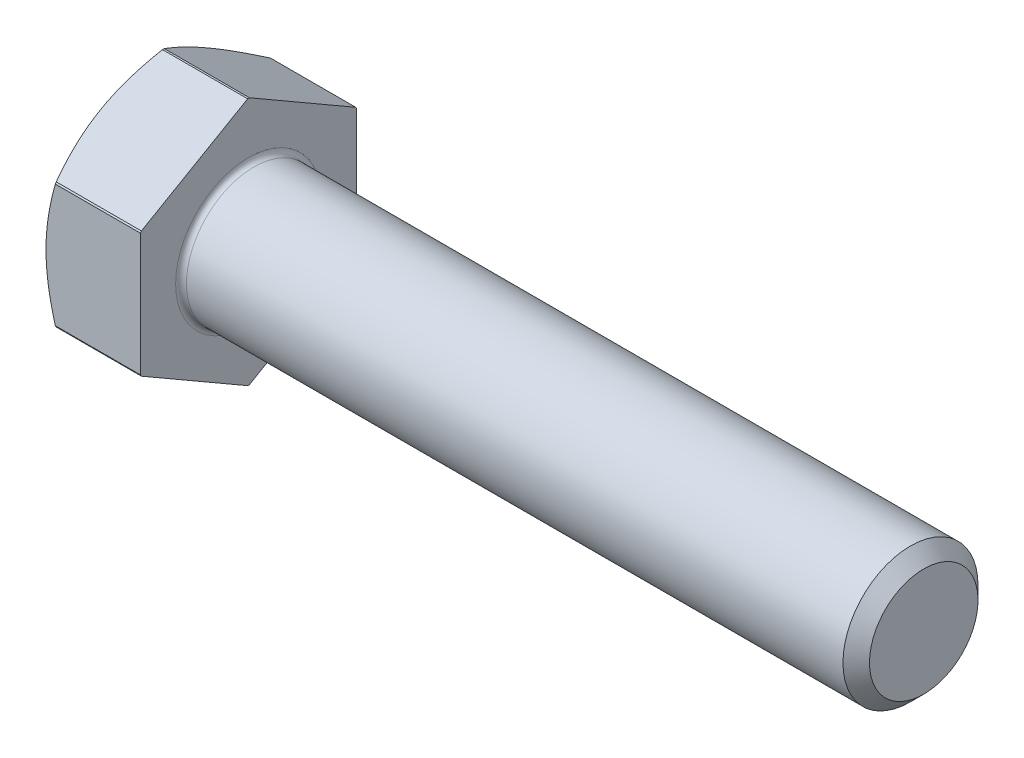
ISO-10303-21;
HEADER;
FILE_DESCRIPTION(('STEP AP214'),'2;1');
FILE_NAME('part.step','',(''),(''),'','','');
FILE_SCHEMA(('AUTOMOTIVE_DESIGN { 1 0 10303 214 1 1 1 1 }'));
ENDSEC;
DATA;
#1=APPLICATION_CONTEXT('core data for automotive mechanical design processes');
#2=APPLICATION_PROTOCOL_DEFINITION('international standard','automotive_design',2000,#1);
#3=PRODUCT_CONTEXT('',#1,'mechanical');
#4=PRODUCT('Part','Part','',(#3));
#5=PRODUCT_RELATED_PRODUCT_CATEGORY('part','',(#4));
#6=PRODUCT_DEFINITION_FORMATION('','',#4);
#7=PRODUCT_DEFINITION_CONTEXT('part definition',#1,'design');
#8=PRODUCT_DEFINITION('design','',#6,#7);
#9=PRODUCT_DEFINITION_SHAPE('','',#8);
#10=(LENGTH_UNIT() NAMED_UNIT(*) SI_UNIT(.MILLI.,.METRE.));
#11=(NAMED_UNIT(*) PLANE_ANGLE_UNIT() SI_UNIT($,.RADIAN.));
#12=(NAMED_UNIT(*) SI_UNIT($,.STERADIAN.) SOLID_ANGLE_UNIT());
#13=UNCERTAINTY_MEASURE_WITH_UNIT(LENGTH_MEASURE(1.E-05),#10,'distance_accuracy_value','');
#14=(GEOMETRIC_REPRESENTATION_CONTEXT(3) GLOBAL_UNCERTAINTY_ASSIGNED_CONTEXT((#13)) GLOBAL_UNIT_ASSIGNED_CONTEXT((#10,
#11,#12)) REPRESENTATION_CONTEXT('',''));
#15=CARTESIAN_POINT('',(0.,0.,0.));
#16=DIRECTION('',(0.,0.,1.));
#17=DIRECTION('',(1.,0.,0.));
#18=AXIS2_PLACEMENT_3D('',#15,#16,#17);
#19=CARTESIAN_POINT('',(-3.5,2.,0.));
#20=DIRECTION('',(-1.,0.,0.));
#21=DIRECTION('',(0.,0.,1.));
#22=AXIS2_PLACEMENT_3D('',#19,#20,#21);
#23=PLANE('',#22);
#24=CARTESIAN_POINT('',(-3.49999999998931,0.,0.));
#25=DIRECTION('',(1.,0.,0.));
#26=DIRECTION('',(0.,0.,-1.));
#27=AXIS2_PLACEMENT_3D('',#24,#25,#26);
#28=CIRCLE('',#27,4.0000000000191);
#29=CARTESIAN_POINT('',(-3.49999999999482,0.,4.00000000000955));
#30=VERTEX_POINT('',#29);
#31=CARTESIAN_POINT('',(-3.49999999999482,-3.46410161514602,2.00000000000478));
#32=VERTEX_POINT('',#31);
#33=EDGE_CURVE('E436',#30,#32,#28,.T.);
#34=ORIENTED_EDGE('',*,*,#33,.F.);
#35=CARTESIAN_POINT('',(-3.49999999998931,0.,0.));
#36=DIRECTION('',(1.,0.,0.));
#37=DIRECTION('',(0.,0.,-1.));
#38=AXIS2_PLACEMENT_3D('',#35,#36,#37);
#39=CIRCLE('',#38,4.0000000000191);
#40=CARTESIAN_POINT('',(-3.49999999999483,3.46410161514602,2.00000000000478));
#41=VERTEX_POINT('',#40);
#42=EDGE_CURVE('E144',#41,#30,#39,.T.);
#43=ORIENTED_EDGE('',*,*,#42,.F.);
#44=CARTESIAN_POINT('',(-3.49999999998931,0.,0.));
#45=DIRECTION('',(1.,0.,0.));
#46=DIRECTION('',(0.,0.,-1.));
#47=AXIS2_PLACEMENT_3D('',#44,#45,#46);
#48=CIRCLE('',#47,4.0000000000191);
#49=CARTESIAN_POINT('',(-3.49999999999482,3.46410161514603,-2.00000000000478));
#50=VERTEX_POINT('',#49);
#51=EDGE_CURVE('E438',#50,#41,#48,.T.);
#52=ORIENTED_EDGE('',*,*,#51,.F.);
#53=CARTESIAN_POINT('',(-3.49999999998931,0.,0.));
#54=DIRECTION('',(1.,0.,0.));
#55=DIRECTION('',(0.,0.,-1.));
#56=AXIS2_PLACEMENT_3D('',#53,#54,#55);
#57=CIRCLE('',#56,4.0000000000191);
#58=CARTESIAN_POINT('',(-3.49999999999482,0.,-4.00000000000955));
#59=VERTEX_POINT('',#58);
#60=EDGE_CURVE('E453',#59,#50,#57,.T.);
#61=ORIENTED_EDGE('',*,*,#60,.F.);
#62=CARTESIAN_POINT('',(-3.49999999998931,0.,0.));
#63=DIRECTION('',(1.,0.,0.));
#64=DIRECTION('',(0.,0.,-1.));
#65=AXIS2_PLACEMENT_3D('',#62,#63,#64);
#66=CIRCLE('',#65,4.0000000000191);
#67=CARTESIAN_POINT('',(-3.49999999999483,-3.46410161514602,-2.00000000000477));
#68=VERTEX_POINT('',#67);
#69=EDGE_CURVE('E456',#68,#59,#66,.T.);
#70=ORIENTED_EDGE('',*,*,#69,.F.);
#71=CARTESIAN_POINT('',(-3.49999999998931,0.,0.));
#72=DIRECTION('',(1.,0.,0.));
#73=DIRECTION('',(0.,0.,-1.));
#74=AXIS2_PLACEMENT_3D('',#71,#72,#73);
#75=CIRCLE('',#74,4.0000000000191);
#76=EDGE_CURVE('E423',#32,#68,#75,.T.);
#77=ORIENTED_EDGE('',*,*,#76,.F.);
#78=EDGE_LOOP('',(#34,#43,#52,#61,#70,#77));
#79=FACE_BOUND('',#78,.T.);
#80=ADVANCED_FACE('F17',(#79),#23,.T.);
#81=CARTESIAN_POINT('',(-3.1535898385755,0.,0.));
#82=DIRECTION('',(1.,0.,0.));
#83=DIRECTION('',(0.,0.,-1.));
#84=AXIS2_PLACEMENT_3D('',#81,#82,#83);
#85=CONICAL_SURFACE('',#84,4.59999999986849,1.04719755121286);
#86=CARTESIAN_POINT('',(-3.50000000000034,3.46410161513775,2.));
#87=CARTESIAN_POINT('',(-3.500015289838,3.51228454323649,1.91654472047554));
#88=CARTESIAN_POINT('',(-3.49798980460845,3.56046529591686,1.83309320888624));
#89=CARTESIAN_POINT('',(-3.48997086316399,3.65673560713574,1.66634813859466));
#90=CARTESIAN_POINT('',(-3.48397814174436,3.70482518090822,1.58305455350639));
#91=CARTESIAN_POINT('',(-3.46817687571658,3.80060992221532,1.41715051497265));
#92=CARTESIAN_POINT('',(-3.45838709371599,3.84830586925362,1.33453871138722));
#93=CARTESIAN_POINT('',(-3.43519618315752,3.94347716290652,1.16969719535834));
#94=CARTESIAN_POINT('',(-3.42179496830987,3.99095250422251,1.08746749209237));
#95=CARTESIAN_POINT('',(-3.37657493969524,4.13285817557343,0.841679659430397));
#96=CARTESIAN_POINT('',(-3.3397189156875,4.22688754609592,0.67881601228172));
#97=CARTESIAN_POINT('',(-3.25463489374141,4.41415290148627,0.354462902248197));
#98=CARTESIAN_POINT('',(-3.20635141412474,4.50738264049076,0.192984257516034));
#99=CARTESIAN_POINT('',(-3.15358983849857,4.59988328429957,0.0327684427063481));
#100=B_SPLINE_CURVE_WITH_KNOTS('',3,(#86,#87,#88,#89,#90,#91,#92,#93,#94,#95,#96,#97,#98,#99),
.UNSPECIFIED.,.F.,.F.,(4,2,2,2,2,2,4),(0.,0.289069278709163,0.578085032161773,0.865690487405985,
1.15330281516018,1.72781024307476,2.30516636160278),.UNSPECIFIED.);
#101=CARTESIAN_POINT('',(-3.15358983849239,4.59988328429869,0.0327684427078727));
#102=VERTEX_POINT('',#101);
#103=EDGE_CURVE('E278',#41,#102,#100,.T.);
#104=ORIENTED_EDGE('',*,*,#103,.T.);
#105=CARTESIAN_POINT('',(-3.15358983848622,0.,0.));
#106=DIRECTION('',(1.,0.,0.));
#107=DIRECTION('',(0.,0.,-1.));
#108=AXIS2_PLACEMENT_3D('',#105,#106,#107);
#109=CIRCLE('',#108,4.6);
#110=CARTESIAN_POINT('',(-3.15358983849289,4.59988328429781,-0.0327684427094049));
#111=VERTEX_POINT('',#110);
#112=EDGE_CURVE('E145',#111,#102,#109,.T.);
#113=ORIENTED_EDGE('',*,*,#112,.F.);
#114=CARTESIAN_POINT('',(-3.15358983849856,4.59988328429957,-0.032768442706354));
#115=CARTESIAN_POINT('',(-3.20635141412474,4.50738264049076,-0.192984257516039));
#116=CARTESIAN_POINT('',(-3.2546348937414,4.41415290148627,-0.354462902248203));
#117=CARTESIAN_POINT('',(-3.33971891568749,4.22688754609593,-0.678816012281726));
#118=CARTESIAN_POINT('',(-3.37657493969524,4.13285817557344,-0.841679659430403));
#119=CARTESIAN_POINT('',(-3.42179496830987,3.99095250422251,-1.08746749209237));
#120=CARTESIAN_POINT('',(-3.43519618315751,3.94347716290652,-1.16969719535834));
#121=CARTESIAN_POINT('',(-3.45838709371599,3.84830586925362,-1.33453871138722));
#122=CARTESIAN_POINT('',(-3.46817687571658,3.80060992221533,-1.41715051497266));
#123=CARTESIAN_POINT('',(-3.48397814174436,3.70482518090823,-1.5830545535064));
#124=CARTESIAN_POINT('',(-3.48997086316399,3.65673560713575,-1.66634813859467));
#125=CARTESIAN_POINT('',(-3.49798980460844,3.56046529591687,-1.83309320888624));
#126=CARTESIAN_POINT('',(-3.50001528983799,3.5122845432365,-1.91654472047555));
#127=CARTESIAN_POINT('',(-3.50000000000034,3.46410161513776,-2.00000000000001));
#128=B_SPLINE_CURVE_WITH_KNOTS('',3,(#114,#115,#116,#117,#118,#119,#120,#121,#122,#123,#124,
#125,#126,#127),.UNSPECIFIED.,.F.,.F.,(4,2,2,2,2,2,4),(0.,0.577356118528021,1.15186354644259,
1.43947587419679,1.72708132944101,2.01609708289362,2.30516636160278),.UNSPECIFIED.);
#129=EDGE_CURVE('E154',#111,#50,#128,.T.);
#130=ORIENTED_EDGE('',*,*,#129,.T.);
#131=ORIENTED_EDGE('',*,*,#51,.T.);
#132=EDGE_LOOP('',(#104,#113,#130,#131));
#133=FACE_BOUND('',#132,.T.);
#134=ADVANCED_FACE('F290',(#133),#85,.T.);
#135=CARTESIAN_POINT('',(-1.57679491924311,0.,0.));
#136=DIRECTION('',(1.,0.,0.));
#137=DIRECTION('',(0.,0.,-1.));
#138=AXIS2_PLACEMENT_3D('',#135,#136,#137);
#139=CYLINDRICAL_SURFACE('',#138,4.6);
#140=DIRECTION('',(1.,0.,0.));
#141=VECTOR('',#140,1.);
#142=CARTESIAN_POINT('',(0.,4.59988328429781,0.0327684427093968));
#143=LINE('',#142,#141);
#144=CARTESIAN_POINT('',(0.,4.59988328429781,0.0327684427093985));
#145=VERTEX_POINT('',#144);
#146=EDGE_CURVE('E139',#102,#145,#143,.T.);
#147=ORIENTED_EDGE('',*,*,#146,.T.);
#148=CARTESIAN_POINT('',(0.,0.,0.));
#149=DIRECTION('',(1.,0.,0.));
#150=DIRECTION('',(0.,0.,-1.));
#151=AXIS2_PLACEMENT_3D('',#148,#149,#150);
#152=CIRCLE('',#151,4.6);
#153=CARTESIAN_POINT('',(0.,4.59988328429781,-0.032768442709401));
#154=VERTEX_POINT('',#153);
#155=EDGE_CURVE('E132',#145,#154,#152,.F.);
#156=ORIENTED_EDGE('',*,*,#155,.T.);
#157=DIRECTION('',(1.,0.,0.));
#158=VECTOR('',#157,1.);
#159=CARTESIAN_POINT('',(0.,4.59988328429781,-0.0327684427094017));
#160=LINE('',#159,#158);
#161=EDGE_CURVE('E136',#154,#111,#160,.F.);
#162=ORIENTED_EDGE('',*,*,#161,.T.);
#163=ORIENTED_EDGE('',*,*,#112,.T.);
#164=EDGE_LOOP('',(#147,#156,#162,#163));
#165=FACE_BOUND('',#164,.T.);
#166=ADVANCED_FACE('F134',(#165),#139,.T.);
#167=CARTESIAN_POINT('',(-3.1535898385755,0.,0.));
#168=DIRECTION('',(1.,0.,0.));
#169=DIRECTION('',(0.,0.,-1.));
#170=AXIS2_PLACEMENT_3D('',#167,#168,#169);
#171=CONICAL_SURFACE('',#170,4.59999999986849,1.04719755121286);
#172=CARTESIAN_POINT('',(-3.15358983849857,2.32831994597594,3.96723155729365));
#173=CARTESIAN_POINT('',(-3.20635141412474,2.42082058978475,3.80701574248396));
#174=CARTESIAN_POINT('',(-3.25463489374141,2.51405032878924,3.6455370977518));
#175=CARTESIAN_POINT('',(-3.3397189156875,2.70131568417958,3.32118398771828));
#176=CARTESIAN_POINT('',(-3.37657493969524,2.79534505470207,3.1583203405696));
#177=CARTESIAN_POINT('',(-3.42179496830987,2.937250726053,2.91253250790763));
#178=CARTESIAN_POINT('',(-3.43519618315752,2.98472606736899,2.83030280464166));
#179=CARTESIAN_POINT('',(-3.45838709371599,3.07989736102189,2.66546128861278));
#180=CARTESIAN_POINT('',(-3.46817687571658,3.12759330806018,2.58284948502734));
#181=CARTESIAN_POINT('',(-3.48397814174436,3.22337804936728,2.41694544649361));
#182=CARTESIAN_POINT('',(-3.48997086316399,3.27146762313976,2.33365186140534));
#183=CARTESIAN_POINT('',(-3.49798980460845,3.36773793435864,2.16690679111376));
#184=CARTESIAN_POINT('',(-3.500015289838,3.41591868703901,2.08345527952446));
#185=CARTESIAN_POINT('',(-3.50000000000034,3.46410161513775,2.));
#186=B_SPLINE_CURVE_WITH_KNOTS('',3,(#172,#173,#174,#175,#176,#177,#178,#179,#180,#181,#182,
#183,#184,#185),.UNSPECIFIED.,.F.,.F.,(4,2,2,2,2,2,4),(0.,0.577356118528019,1.15186354644259,
1.43947587419679,1.727081329441,2.01609708289361,2.30516636160277),.UNSPECIFIED.);
#187=CARTESIAN_POINT('',(-3.1535898384929,2.3283199459777,3.9672315572906));
#188=VERTEX_POINT('',#187);
#189=EDGE_CURVE('E155',#188,#41,#186,.T.);
#190=ORIENTED_EDGE('',*,*,#189,.T.);
#191=ORIENTED_EDGE('',*,*,#42,.T.);
#192=CARTESIAN_POINT('',(-3.50000000000034,0.,4.));
#193=CARTESIAN_POINT('',(-3.500015289838,0.0963658561974825,4.));
#194=CARTESIAN_POINT('',(-3.49798980460844,0.192727361558217,4.));
#195=CARTESIAN_POINT('',(-3.48997086316399,0.38526798399598,4.));
#196=CARTESIAN_POINT('',(-3.48397814174436,0.481447131540947,4.));
#197=CARTESIAN_POINT('',(-3.46817687571658,0.673016614155145,4.));
#198=CARTESIAN_POINT('',(-3.45838709371599,0.768408508231729,4.));
#199=CARTESIAN_POINT('',(-3.43519618315752,0.95875109553753,4.));
#200=CARTESIAN_POINT('',(-3.42179496830987,1.05370177816951,4.));
#201=CARTESIAN_POINT('',(-3.37657493969524,1.33751312087136,4.));
#202=CARTESIAN_POINT('',(-3.3397189156875,1.52557186191634,4.));
#203=CARTESIAN_POINT('',(-3.2546348937414,1.90010257269703,4.));
#204=CARTESIAN_POINT('',(-3.20635141412474,2.08656205070602,4.));
#205=CARTESIAN_POINT('',(-3.15358983849857,2.27156333832363,4.));
#206=B_SPLINE_CURVE_WITH_KNOTS('',3,(#192,#193,#194,#195,#196,#197,#198,#199,#200,#201,#202,
#203,#204,#205),.UNSPECIFIED.,.F.,.F.,(4,2,2,2,2,2,4),(0.,0.289069278709163,0.578085032161773,
0.865690487405983,1.15330281516018,1.72781024307476,2.30516636160278),.UNSPECIFIED.);
#207=CARTESIAN_POINT('',(-3.15358983849239,2.27156333832187,4.));
#208=VERTEX_POINT('',#207);
#209=EDGE_CURVE('E248',#30,#208,#206,.T.);
#210=ORIENTED_EDGE('',*,*,#209,.T.);
#211=CARTESIAN_POINT('',(-3.15358983848622,0.,0.));
#212=DIRECTION('',(1.,0.,0.));
#213=DIRECTION('',(0.,0.,-1.));
#214=AXIS2_PLACEMENT_3D('',#211,#212,#213);
#215=CIRCLE('',#214,4.6);
#216=EDGE_CURVE('E434',#188,#208,#215,.T.);
#217=ORIENTED_EDGE('',*,*,#216,.F.);
#218=EDGE_LOOP('',(#190,#191,#210,#217));
#219=FACE_BOUND('',#218,.T.);
#220=ADVANCED_FACE('F502',(#219),#171,.T.);
#221=CARTESIAN_POINT('',(-1.57679491924311,0.,0.));
#222=DIRECTION('',(1.,0.,0.));
#223=DIRECTION('',(0.,0.,-1.));
#224=AXIS2_PLACEMENT_3D('',#221,#222,#223);
#225=CYLINDRICAL_SURFACE('',#224,4.6);
#226=DIRECTION('',(1.,0.,0.));
#227=VECTOR('',#226,1.);
#228=CARTESIAN_POINT('',(0.,2.3283199459777,3.9672315572906));
#229=LINE('',#228,#227);
#230=CARTESIAN_POINT('',(0.,2.3283199459777,3.9672315572906));
#231=VERTEX_POINT('',#230);
#232=EDGE_CURVE('E277',#231,#188,#229,.F.);
#233=ORIENTED_EDGE('',*,*,#232,.T.);
#234=ORIENTED_EDGE('',*,*,#216,.T.);
#235=DIRECTION('',(-1.,0.,0.));
#236=VECTOR('',#235,1.);
#237=CARTESIAN_POINT('',(0.,2.27156333832011,4.));
#238=LINE('',#237,#236);
#239=CARTESIAN_POINT('',(0.,2.27156333832011,4.));
#240=VERTEX_POINT('',#239);
#241=EDGE_CURVE('E401',#208,#240,#238,.F.);
#242=ORIENTED_EDGE('',*,*,#241,.T.);
#243=CARTESIAN_POINT('',(0.,0.,0.));
#244=DIRECTION('',(1.,0.,0.));
#245=DIRECTION('',(0.,0.,-1.));
#246=AXIS2_PLACEMENT_3D('',#243,#244,#245);
#247=CIRCLE('',#246,4.6);
#248=EDGE_CURVE('E437',#240,#231,#247,.F.);
#249=ORIENTED_EDGE('',*,*,#248,.T.);
#250=EDGE_LOOP('',(#233,#234,#242,#249));
#251=FACE_BOUND('',#250,.T.);
#252=ADVANCED_FACE('F268',(#251),#225,.T.);
#253=CARTESIAN_POINT('',(-3.1535898385755,0.,0.));
#254=DIRECTION('',(1.,0.,0.));
#255=DIRECTION('',(0.,0.,-1.));
#256=AXIS2_PLACEMENT_3D('',#253,#254,#255);
#257=CONICAL_SURFACE('',#256,4.59999999986849,1.04719755121286);
#258=CARTESIAN_POINT('',(-3.15358983849857,-2.27156333832363,4.));
#259=CARTESIAN_POINT('',(-3.20635141412474,-2.08656205070602,4.));
#260=CARTESIAN_POINT('',(-3.25463489374141,-1.90010257269703,4.));
#261=CARTESIAN_POINT('',(-3.3397189156875,-1.52557186191634,4.));
#262=CARTESIAN_POINT('',(-3.37657493969524,-1.33751312087136,4.));
#263=CARTESIAN_POINT('',(-3.42179496830987,-1.05370177816951,4.));
#264=CARTESIAN_POINT('',(-3.43519618315752,-0.958751095537529,4.));
#265=CARTESIAN_POINT('',(-3.45838709371599,-0.768408508231728,4.));
#266=CARTESIAN_POINT('',(-3.46817687571658,-0.673016614155144,4.));
#267=CARTESIAN_POINT('',(-3.48397814174436,-0.481447131540946,4.));
#268=CARTESIAN_POINT('',(-3.48997086316399,-0.385267983995979,4.));
#269=CARTESIAN_POINT('',(-3.49798980460844,-0.192727361558216,4.));
#270=CARTESIAN_POINT('',(-3.500015289838,-0.0963658561974812,4.));
#271=CARTESIAN_POINT('',(-3.50000000000034,0.,4.));
#272=B_SPLINE_CURVE_WITH_KNOTS('',3,(#258,#259,#260,#261,#262,#263,#264,#265,#266,#267,#268,
#269,#270,#271),.UNSPECIFIED.,.F.,.F.,(4,2,2,2,2,2,4),(0.,0.57735611852802,1.15186354644259,
1.43947587419679,1.727081329441,2.01609708289361,2.30516636160278),.UNSPECIFIED.);
#273=CARTESIAN_POINT('',(-3.15358983849289,-2.27156333832011,4.));
#274=VERTEX_POINT('',#273);
#275=EDGE_CURVE('E271',#274,#30,#272,.T.);
#276=ORIENTED_EDGE('',*,*,#275,.T.);
#277=ORIENTED_EDGE('',*,*,#33,.T.);
#278=CARTESIAN_POINT('',(-3.50000000000033,-3.46410161513776,2.00000000000001));
#279=CARTESIAN_POINT('',(-3.50001528983799,-3.41591868703902,2.08345527952446));
#280=CARTESIAN_POINT('',(-3.49798980460844,-3.36773793435865,2.16690679111377));
#281=CARTESIAN_POINT('',(-3.48997086316399,-3.27146762313977,2.33365186140534));
#282=CARTESIAN_POINT('',(-3.48397814174436,-3.22337804936728,2.41694544649361));
#283=CARTESIAN_POINT('',(-3.46817687571658,-3.12759330806018,2.58284948502735));
#284=CARTESIAN_POINT('',(-3.45838709371599,-3.07989736102189,2.66546128861279));
#285=CARTESIAN_POINT('',(-3.43519618315751,-2.98472606736899,2.83030280464167));
#286=CARTESIAN_POINT('',(-3.42179496830987,-2.937250726053,2.91253250790764));
#287=CARTESIAN_POINT('',(-3.37657493969523,-2.79534505470208,3.1583203405696));
#288=CARTESIAN_POINT('',(-3.33971891568749,-2.70131568417959,3.32118398771828));
#289=CARTESIAN_POINT('',(-3.2546348937414,-2.51405032878924,3.6455370977518));
#290=CARTESIAN_POINT('',(-3.20635141412474,-2.42082058978475,3.80701574248397));
#291=CARTESIAN_POINT('',(-3.15358983849856,-2.32831994597594,3.96723155729365));
#292=B_SPLINE_CURVE_WITH_KNOTS('',3,(#278,#279,#280,#281,#282,#283,#284,#285,#286,#287,#288,
#289,#290,#291),.UNSPECIFIED.,.F.,.F.,(4,2,2,2,2,2,4),(0.,0.289069278709162,0.578085032161772,
0.865690487405982,1.15330281516018,1.72781024307475,2.30516636160277),.UNSPECIFIED.);
#293=CARTESIAN_POINT('',(-3.15358983849239,-2.32831994597682,3.96723155729213));
#294=VERTEX_POINT('',#293);
#295=EDGE_CURVE('E220',#32,#294,#292,.T.);
#296=ORIENTED_EDGE('',*,*,#295,.T.);
#297=CARTESIAN_POINT('',(-3.15358983848622,0.,0.));
#298=DIRECTION('',(1.,0.,0.));
#299=DIRECTION('',(0.,0.,-1.));
#300=AXIS2_PLACEMENT_3D('',#297,#298,#299);
#301=CIRCLE('',#300,4.6);
#302=EDGE_CURVE('E428',#274,#294,#301,.T.);
#303=ORIENTED_EDGE('',*,*,#302,.F.);
#304=EDGE_LOOP('',(#276,#277,#296,#303));
#305=FACE_BOUND('',#304,.T.);
#306=ADVANCED_FACE('F263',(#305),#257,.T.);
#307=CARTESIAN_POINT('',(-1.57679491924311,0.,0.));
#308=DIRECTION('',(1.,0.,0.));
#309=DIRECTION('',(0.,0.,-1.));
#310=AXIS2_PLACEMENT_3D('',#307,#308,#309);
#311=CYLINDRICAL_SURFACE('',#310,4.6);
#312=DIRECTION('',(-1.,0.,0.));
#313=VECTOR('',#312,1.);
#314=CARTESIAN_POINT('',(0.,-2.27156333832011,4.));
#315=LINE('',#314,#313);
#316=CARTESIAN_POINT('',(0.,-2.27156333832011,4.));
#317=VERTEX_POINT('',#316);
#318=EDGE_CURVE('E247',#317,#274,#315,.T.);
#319=ORIENTED_EDGE('',*,*,#318,.T.);
#320=ORIENTED_EDGE('',*,*,#302,.T.);
#321=DIRECTION('',(1.,0.,0.));
#322=VECTOR('',#321,1.);
#323=CARTESIAN_POINT('',(0.,-2.3283199459777,3.9672315572906));
#324=LINE('',#323,#322);
#325=CARTESIAN_POINT('',(0.,-2.3283199459777,3.9672315572906));
#326=VERTEX_POINT('',#325);
#327=EDGE_CURVE('E396',#294,#326,#324,.T.);
#328=ORIENTED_EDGE('',*,*,#327,.T.);
#329=CARTESIAN_POINT('',(0.,0.,0.));
#330=DIRECTION('',(1.,0.,0.));
#331=DIRECTION('',(0.,0.,-1.));
#332=AXIS2_PLACEMENT_3D('',#329,#330,#331);
#333=CIRCLE('',#332,4.6);
#334=EDGE_CURVE('E431',#326,#317,#333,.F.);
#335=ORIENTED_EDGE('',*,*,#334,.T.);
#336=EDGE_LOOP('',(#319,#320,#328,#335));
#337=FACE_BOUND('',#336,.T.);
#338=ADVANCED_FACE('F259',(#337),#311,.T.);
#339=CARTESIAN_POINT('',(-3.1535898385755,0.,0.));
#340=DIRECTION('',(1.,0.,0.));
#341=DIRECTION('',(0.,0.,-1.));
#342=AXIS2_PLACEMENT_3D('',#339,#340,#341);
#343=CONICAL_SURFACE('',#342,4.59999999986849,1.04719755121286);
#344=CARTESIAN_POINT('',(-3.50000000000034,-3.46410161513775,-2.));
#345=CARTESIAN_POINT('',(-3.500015289838,-3.51228454323649,-1.91654472047554));
#346=CARTESIAN_POINT('',(-3.49798980460845,-3.56046529591686,-1.83309320888623));
#347=CARTESIAN_POINT('',(-3.48997086316399,-3.65673560713574,-1.66634813859466));
#348=CARTESIAN_POINT('',(-3.48397814174436,-3.70482518090822,-1.58305455350639));
#349=CARTESIAN_POINT('',(-3.46817687571658,-3.80060992221532,-1.41715051497265));
#350=CARTESIAN_POINT('',(-3.45838709371599,-3.84830586925362,-1.33453871138722));
#351=CARTESIAN_POINT('',(-3.43519618315752,-3.94347716290652,-1.16969719535834));
#352=CARTESIAN_POINT('',(-3.42179496830987,-3.99095250422251,-1.08746749209237));
#353=CARTESIAN_POINT('',(-3.37657493969524,-4.13285817557343,-0.841679659430396));
#354=CARTESIAN_POINT('',(-3.3397189156875,-4.22688754609592,-0.678816012281719));
#355=CARTESIAN_POINT('',(-3.25463489374141,-4.41415290148627,-0.354462902248197));
#356=CARTESIAN_POINT('',(-3.20635141412474,-4.50738264049076,-0.192984257516033));
#357=CARTESIAN_POINT('',(-3.15358983849857,-4.59988328429957,-0.0327684427063473));
#358=B_SPLINE_CURVE_WITH_KNOTS('',3,(#344,#345,#346,#347,#348,#349,#350,#351,#352,#353,#354,
#355,#356,#357),.UNSPECIFIED.,.F.,.F.,(4,2,2,2,2,2,4),(0.,0.289069278709163,0.578085032161774,
0.865690487405984,1.15330281516018,1.72781024307476,2.30516636160278),.UNSPECIFIED.);
#359=CARTESIAN_POINT('',(-3.15358983849239,-4.59988328429869,-0.0327684427078723));
#360=VERTEX_POINT('',#359);
#361=EDGE_CURVE('E214',#68,#360,#358,.T.);
#362=ORIENTED_EDGE('',*,*,#361,.T.);
#363=CARTESIAN_POINT('',(-3.15358983848622,0.,0.));
#364=DIRECTION('',(1.,0.,0.));
#365=DIRECTION('',(0.,0.,-1.));
#366=AXIS2_PLACEMENT_3D('',#363,#364,#365);
#367=CIRCLE('',#366,4.6);
#368=CARTESIAN_POINT('',(-3.15358983849289,-4.59988328429781,0.0327684427094049));
#369=VERTEX_POINT('',#368);
#370=EDGE_CURVE('E419',#369,#360,#367,.T.);
#371=ORIENTED_EDGE('',*,*,#370,.F.);
#372=CARTESIAN_POINT('',(-3.15358983849856,-4.59988328429957,0.0327684427063539));
#373=CARTESIAN_POINT('',(-3.20635141412474,-4.50738264049077,0.192984257516039));
#374=CARTESIAN_POINT('',(-3.2546348937414,-4.41415290148627,0.354462902248203));
#375=CARTESIAN_POINT('',(-3.33971891568749,-4.22688754609593,0.678816012281726));
#376=CARTESIAN_POINT('',(-3.37657493969523,-4.13285817557343,0.841679659430403));
#377=CARTESIAN_POINT('',(-3.42179496830987,-3.99095250422251,1.08746749209237));
#378=CARTESIAN_POINT('',(-3.43519618315751,-3.94347716290652,1.16969719535834));
#379=CARTESIAN_POINT('',(-3.45838709371599,-3.84830586925362,1.33453871138722));
#380=CARTESIAN_POINT('',(-3.46817687571658,-3.80060992221533,1.41715051497266));
#381=CARTESIAN_POINT('',(-3.48397814174436,-3.70482518090823,1.5830545535064));
#382=CARTESIAN_POINT('',(-3.48997086316399,-3.65673560713575,1.66634813859467));
#383=CARTESIAN_POINT('',(-3.49798980460844,-3.56046529591686,1.83309320888624));
#384=CARTESIAN_POINT('',(-3.50001528983799,-3.5122845432365,1.91654472047555));
#385=CARTESIAN_POINT('',(-3.50000000000033,-3.46410161513776,2.00000000000001));
#386=B_SPLINE_CURVE_WITH_KNOTS('',3,(#372,#373,#374,#375,#376,#377,#378,#379,#380,#381,#382,
#383,#384,#385),.UNSPECIFIED.,.F.,.F.,(4,2,2,2,2,2,4),(0.,0.577356118528021,1.1518635464426,
1.4394758741968,1.72708132944101,2.01609708289362,2.30516636160278),.UNSPECIFIED.);
#387=EDGE_CURVE('E241',#369,#32,#386,.T.);
#388=ORIENTED_EDGE('',*,*,#387,.T.);
#389=ORIENTED_EDGE('',*,*,#76,.T.);
#390=EDGE_LOOP('',(#362,#371,#388,#389));
#391=FACE_BOUND('',#390,.T.);
#392=ADVANCED_FACE('F254',(#391),#343,.T.);
#393=CARTESIAN_POINT('',(-1.57679491924311,0.,0.));
#394=DIRECTION('',(1.,0.,0.));
#395=DIRECTION('',(0.,0.,-1.));
#396=AXIS2_PLACEMENT_3D('',#393,#394,#395);
#397=CYLINDRICAL_SURFACE('',#396,4.6);
#398=DIRECTION('',(1.,0.,0.));
#399=VECTOR('',#398,1.);
#400=CARTESIAN_POINT('',(0.,-4.59988328429781,-0.0327684427093968));
#401=LINE('',#400,#399);
#402=CARTESIAN_POINT('',(0.,-4.59988328429781,-0.0327684427093987));
#403=VERTEX_POINT('',#402);
#404=EDGE_CURVE('E391',#360,#403,#401,.T.);
#405=ORIENTED_EDGE('',*,*,#404,.T.);
#406=CARTESIAN_POINT('',(0.,0.,0.));
#407=DIRECTION('',(1.,0.,0.));
#408=DIRECTION('',(0.,0.,-1.));
#409=AXIS2_PLACEMENT_3D('',#406,#407,#408);
#410=CIRCLE('',#409,4.6);
#411=CARTESIAN_POINT('',(0.,-4.59988328429781,0.0327684427094012));
#412=VERTEX_POINT('',#411);
#413=EDGE_CURVE('E422',#403,#412,#410,.F.);
#414=ORIENTED_EDGE('',*,*,#413,.T.);
#415=DIRECTION('',(1.,0.,0.));
#416=VECTOR('',#415,1.);
#417=CARTESIAN_POINT('',(0.,-4.59988328429781,0.0327684427094017));
#418=LINE('',#417,#416);
#419=EDGE_CURVE('E215',#412,#369,#418,.F.);
#420=ORIENTED_EDGE('',*,*,#419,.T.);
#421=ORIENTED_EDGE('',*,*,#370,.T.);
#422=EDGE_LOOP('',(#405,#414,#420,#421));
#423=FACE_BOUND('',#422,.T.);
#424=ADVANCED_FACE('F258',(#423),#397,.T.);
#425=CARTESIAN_POINT('',(-3.1535898385755,0.,0.));
#426=DIRECTION('',(1.,0.,0.));
#427=DIRECTION('',(0.,0.,-1.));
#428=AXIS2_PLACEMENT_3D('',#425,#426,#427);
#429=CONICAL_SURFACE('',#428,4.59999999986849,1.04719755121286);
#430=CARTESIAN_POINT('',(-3.15358983849857,2.27156333832363,-4.));
#431=CARTESIAN_POINT('',(-3.20635141412474,2.08656205070602,-4.));
#432=CARTESIAN_POINT('',(-3.25463489374141,1.90010257269703,-4.));
#433=CARTESIAN_POINT('',(-3.3397189156875,1.52557186191634,-4.));
#434=CARTESIAN_POINT('',(-3.37657493969524,1.33751312087136,-4.));
#435=CARTESIAN_POINT('',(-3.42179496830987,1.05370177816951,-4.));
#436=CARTESIAN_POINT('',(-3.43519618315752,0.958751095537529,-4.));
#437=CARTESIAN_POINT('',(-3.45838709371599,0.768408508231728,-4.));
#438=CARTESIAN_POINT('',(-3.46817687571658,0.673016614155144,-4.));
#439=CARTESIAN_POINT('',(-3.48397814174436,0.481447131540945,-4.));
#440=CARTESIAN_POINT('',(-3.48997086316399,0.385267983995978,-4.));
#441=CARTESIAN_POINT('',(-3.49798980460844,0.192727361558215,-4.));
#442=CARTESIAN_POINT('',(-3.500015289838,0.0963658561974808,-4.));
#443=CARTESIAN_POINT('',(-3.50000000000034,0.,-4.));
#444=B_SPLINE_CURVE_WITH_KNOTS('',3,(#430,#431,#432,#433,#434,#435,#436,#437,#438,#439,#440,
#441,#442,#443),.UNSPECIFIED.,.F.,.F.,(4,2,2,2,2,2,4),(0.,0.57735611852802,1.15186354644259,
1.43947587419679,1.72708132944101,2.01609708289362,2.30516636160278),.UNSPECIFIED.);
#445=CARTESIAN_POINT('',(-3.15358983849289,2.27156333832011,-4.));
#446=VERTEX_POINT('',#445);
#447=EDGE_CURVE('E186',#446,#59,#444,.T.);
#448=ORIENTED_EDGE('',*,*,#447,.T.);
#449=ORIENTED_EDGE('',*,*,#60,.T.);
#450=CARTESIAN_POINT('',(-3.50000000000034,3.46410161513776,-2.));
#451=CARTESIAN_POINT('',(-3.50001528983799,3.41591868703902,-2.08345527952446));
#452=CARTESIAN_POINT('',(-3.49798980460844,3.36773793435865,-2.16690679111377));
#453=CARTESIAN_POINT('',(-3.48997086316399,3.27146762313977,-2.33365186140534));
#454=CARTESIAN_POINT('',(-3.48397814174436,3.22337804936728,-2.41694544649361));
#455=CARTESIAN_POINT('',(-3.46817687571658,3.12759330806018,-2.58284948502735));
#456=CARTESIAN_POINT('',(-3.45838709371599,3.07989736102189,-2.66546128861278));
#457=CARTESIAN_POINT('',(-3.43519618315751,2.98472606736899,-2.83030280464167));
#458=CARTESIAN_POINT('',(-3.42179496830987,2.937250726053,-2.91253250790763));
#459=CARTESIAN_POINT('',(-3.37657493969523,2.79534505470208,-3.1583203405696));
#460=CARTESIAN_POINT('',(-3.33971891568749,2.70131568417959,-3.32118398771828));
#461=CARTESIAN_POINT('',(-3.2546348937414,2.51405032878924,-3.6455370977518));
#462=CARTESIAN_POINT('',(-3.20635141412474,2.42082058978475,-3.80701574248397));
#463=CARTESIAN_POINT('',(-3.15358983849856,2.32831994597594,-3.96723155729365));
#464=B_SPLINE_CURVE_WITH_KNOTS('',3,(#450,#451,#452,#453,#454,#455,#456,#457,#458,#459,#460,
#461,#462,#463),.UNSPECIFIED.,.F.,.F.,(4,2,2,2,2,2,4),(0.,0.289069278709162,0.578085032161772,
0.865690487405982,1.15330281516018,1.72781024307475,2.30516636160277),.UNSPECIFIED.);
#465=CARTESIAN_POINT('',(-3.15358983849239,2.32831994597682,-3.96723155729213));
#466=VERTEX_POINT('',#465);
#467=EDGE_CURVE('E301',#50,#466,#464,.T.);
#468=ORIENTED_EDGE('',*,*,#467,.T.);
#469=CARTESIAN_POINT('',(-3.15358983848622,0.,0.));
#470=DIRECTION('',(1.,0.,0.));
#471=DIRECTION('',(0.,0.,-1.));
#472=AXIS2_PLACEMENT_3D('',#469,#470,#471);
#473=CIRCLE('',#472,4.6);
#474=EDGE_CURVE('E302',#446,#466,#473,.T.);
#475=ORIENTED_EDGE('',*,*,#474,.F.);
#476=EDGE_LOOP('',(#448,#449,#468,#475));
#477=FACE_BOUND('',#476,.T.);
#478=ADVANCED_FACE('F201',(#477),#429,.T.);
#479=CARTESIAN_POINT('',(-3.1535898385755,0.,0.));
#480=DIRECTION('',(1.,0.,0.));
#481=DIRECTION('',(0.,0.,-1.));
#482=AXIS2_PLACEMENT_3D('',#479,#480,#481);
#483=CONICAL_SURFACE('',#482,4.59999999986849,1.04719755121286);
#484=CARTESIAN_POINT('',(-3.15358983849857,-2.32831994597594,-3.96723155729365));
#485=CARTESIAN_POINT('',(-3.20635141412474,-2.42082058978475,-3.80701574248396));
#486=CARTESIAN_POINT('',(-3.25463489374141,-2.51405032878924,-3.6455370977518));
#487=CARTESIAN_POINT('',(-3.3397189156875,-2.70131568417958,-3.32118398771828));
#488=CARTESIAN_POINT('',(-3.37657493969524,-2.79534505470207,-3.1583203405696));
#489=CARTESIAN_POINT('',(-3.42179496830987,-2.937250726053,-2.91253250790763));
#490=CARTESIAN_POINT('',(-3.43519618315752,-2.98472606736899,-2.83030280464166));
#491=CARTESIAN_POINT('',(-3.45838709371599,-3.07989736102189,-2.66546128861278));
#492=CARTESIAN_POINT('',(-3.46817687571658,-3.12759330806018,-2.58284948502734));
#493=CARTESIAN_POINT('',(-3.48397814174436,-3.22337804936728,-2.41694544649361));
#494=CARTESIAN_POINT('',(-3.48997086316399,-3.27146762313976,-2.33365186140533));
#495=CARTESIAN_POINT('',(-3.49798980460845,-3.36773793435864,-2.16690679111376));
#496=CARTESIAN_POINT('',(-3.500015289838,-3.41591868703901,-2.08345527952446));
#497=CARTESIAN_POINT('',(-3.50000000000034,-3.46410161513775,-2.));
#498=B_SPLINE_CURVE_WITH_KNOTS('',3,(#484,#485,#486,#487,#488,#489,#490,#491,#492,#493,#494,
#495,#496,#497),.UNSPECIFIED.,.F.,.F.,(4,2,2,2,2,2,4),(0.,0.57735611852802,1.15186354644259,
1.43947587419679,1.727081329441,2.01609708289361,2.30516636160277),.UNSPECIFIED.);
#499=CARTESIAN_POINT('',(-3.1535898384929,-2.3283199459777,-3.9672315572906));
#500=VERTEX_POINT('',#499);
#501=EDGE_CURVE('E208',#500,#68,#498,.T.);
#502=ORIENTED_EDGE('',*,*,#501,.T.);
#503=ORIENTED_EDGE('',*,*,#69,.T.);
#504=CARTESIAN_POINT('',(-3.50000000000034,0.,-4.));
#505=CARTESIAN_POINT('',(-3.500015289838,-0.0963658561974831,-4.));
#506=CARTESIAN_POINT('',(-3.49798980460845,-0.192727361558218,-4.));
#507=CARTESIAN_POINT('',(-3.48997086316399,-0.385267983995981,-4.));
#508=CARTESIAN_POINT('',(-3.48397814174436,-0.481447131540947,-4.));
#509=CARTESIAN_POINT('',(-3.46817687571658,-0.673016614155146,-4.));
#510=CARTESIAN_POINT('',(-3.45838709371599,-0.76840850823173,-4.));
#511=CARTESIAN_POINT('',(-3.43519618315752,-0.958751095537531,-4.));
#512=CARTESIAN_POINT('',(-3.42179496830987,-1.05370177816951,-4.));
#513=CARTESIAN_POINT('',(-3.37657493969524,-1.33751312087136,-4.));
#514=CARTESIAN_POINT('',(-3.3397189156875,-1.52557186191634,-4.));
#515=CARTESIAN_POINT('',(-3.25463489374141,-1.90010257269704,-4.));
#516=CARTESIAN_POINT('',(-3.20635141412474,-2.08656205070602,-4.));
#517=CARTESIAN_POINT('',(-3.15358983849857,-2.27156333832363,-4.));
#518=B_SPLINE_CURVE_WITH_KNOTS('',3,(#504,#505,#506,#507,#508,#509,#510,#511,#512,#513,#514,
#515,#516,#517),.UNSPECIFIED.,.F.,.F.,(4,2,2,2,2,2,4),(0.,0.289069278709163,0.578085032161773,
0.865690487405984,1.15330281516018,1.72781024307476,2.30516636160278),.UNSPECIFIED.);
#519=CARTESIAN_POINT('',(-3.15358983849239,-2.27156333832187,-4.));
#520=VERTEX_POINT('',#519);
#521=EDGE_CURVE('E179',#59,#520,#518,.T.);
#522=ORIENTED_EDGE('',*,*,#521,.T.);
#523=CARTESIAN_POINT('',(-3.15358983848622,0.,0.));
#524=DIRECTION('',(1.,0.,0.));
#525=DIRECTION('',(0.,0.,-1.));
#526=AXIS2_PLACEMENT_3D('',#523,#524,#525);
#527=CIRCLE('',#526,4.6);
#528=EDGE_CURVE('E412',#500,#520,#527,.T.);
#529=ORIENTED_EDGE('',*,*,#528,.F.);
#530=EDGE_LOOP('',(#502,#503,#522,#529));
#531=FACE_BOUND('',#530,.T.);
#532=ADVANCED_FACE('F196',(#531),#483,.T.);
#533=CARTESIAN_POINT('',(-1.57679491924311,0.,0.));
#534=DIRECTION('',(1.,0.,0.));
#535=DIRECTION('',(0.,0.,-1.));
#536=AXIS2_PLACEMENT_3D('',#533,#534,#535);
#537=CYLINDRICAL_SURFACE('',#536,4.6);
#538=DIRECTION('',(1.,0.,0.));
#539=VECTOR('',#538,1.);
#540=CARTESIAN_POINT('',(0.,-2.3283199459777,-3.9672315572906));
#541=LINE('',#540,#539);
#542=CARTESIAN_POINT('',(0.,-2.3283199459777,-3.9672315572906));
#543=VERTEX_POINT('',#542);
#544=EDGE_CURVE('E388',#543,#500,#541,.F.);
#545=ORIENTED_EDGE('',*,*,#544,.T.);
#546=ORIENTED_EDGE('',*,*,#528,.T.);
#547=DIRECTION('',(1.,0.,0.));
#548=VECTOR('',#547,1.);
#549=CARTESIAN_POINT('',(0.,-2.27156333832011,-4.));
#550=LINE('',#549,#548);
#551=CARTESIAN_POINT('',(0.,-2.27156333832011,-4.));
#552=VERTEX_POINT('',#551);
#553=EDGE_CURVE('E168',#520,#552,#550,.T.);
#554=ORIENTED_EDGE('',*,*,#553,.T.);
#555=CARTESIAN_POINT('',(0.,0.,0.));
#556=DIRECTION('',(1.,0.,0.));
#557=DIRECTION('',(0.,0.,-1.));
#558=AXIS2_PLACEMENT_3D('',#555,#556,#557);
#559=CIRCLE('',#558,4.6);
#560=EDGE_CURVE('E415',#552,#543,#559,.F.);
#561=ORIENTED_EDGE('',*,*,#560,.T.);
#562=EDGE_LOOP('',(#545,#546,#554,#561));
#563=FACE_BOUND('',#562,.T.);
#564=ADVANCED_FACE('F200',(#563),#537,.T.);
#565=CARTESIAN_POINT('',(-1.57679491924311,0.,0.));
#566=DIRECTION('',(1.,0.,0.));
#567=DIRECTION('',(0.,0.,-1.));
#568=AXIS2_PLACEMENT_3D('',#565,#566,#567);
#569=CYLINDRICAL_SURFACE('',#568,4.6);
#570=DIRECTION('',(1.,0.,0.));
#571=VECTOR('',#570,1.);
#572=CARTESIAN_POINT('',(0.,2.27156333832011,-4.));
#573=LINE('',#572,#571);
#574=CARTESIAN_POINT('',(0.,2.27156333832011,-4.));
#575=VERTEX_POINT('',#574);
#576=EDGE_CURVE('E163',#575,#446,#573,.F.);
#577=ORIENTED_EDGE('',*,*,#576,.T.);
#578=ORIENTED_EDGE('',*,*,#474,.T.);
#579=DIRECTION('',(1.,0.,0.));
#580=VECTOR('',#579,1.);
#581=CARTESIAN_POINT('',(0.,2.3283199459777,-3.9672315572906));
#582=LINE('',#581,#580);
#583=CARTESIAN_POINT('',(0.,2.3283199459777,-3.9672315572906));
#584=VERTEX_POINT('',#583);
#585=EDGE_CURVE('E156',#466,#584,#582,.T.);
#586=ORIENTED_EDGE('',*,*,#585,.T.);
#587=CARTESIAN_POINT('',(0.,0.,0.));
#588=DIRECTION('',(1.,0.,0.));
#589=DIRECTION('',(0.,0.,-1.));
#590=AXIS2_PLACEMENT_3D('',#587,#588,#589);
#591=CIRCLE('',#590,4.6);
#592=EDGE_CURVE('E160',#584,#575,#591,.F.);
#593=ORIENTED_EDGE('',*,*,#592,.T.);
#594=EDGE_LOOP('',(#577,#578,#586,#593));
#595=FACE_BOUND('',#594,.T.);
#596=ADVANCED_FACE('F309',(#595),#569,.T.);
#597=CARTESIAN_POINT('',(0.,4.61880215351701,0.));
#598=DIRECTION('',(0.,-0.866025403784439,0.5));
#599=DIRECTION('',(0.,-0.5,-0.866025403784439));
#600=AXIS2_PLACEMENT_3D('',#597,#598,#599);
#601=PLANE('',#600);
#602=DIRECTION('',(0.,0.5,0.866025403784439));
#603=VECTOR('',#602,1.);
#604=CARTESIAN_POINT('',(0.,2.3283199459777,-3.9672315572906));
#605=LINE('',#604,#603);
#606=EDGE_CURVE('E151',#584,#154,#605,.T.);
#607=ORIENTED_EDGE('',*,*,#606,.F.);
#608=ORIENTED_EDGE('',*,*,#585,.F.);
#609=ORIENTED_EDGE('',*,*,#467,.F.);
#610=ORIENTED_EDGE('',*,*,#129,.F.);
#611=ORIENTED_EDGE('',*,*,#161,.F.);
#612=EDGE_LOOP('',(#607,#608,#609,#610,#611));
#613=FACE_BOUND('',#612,.T.);
#614=ADVANCED_FACE('F149',(#613),#601,.F.);
#615=CARTESIAN_POINT('',(0.,2.3094010767585,4.));
#616=DIRECTION('',(0.,-0.866025403784439,-0.5));
#617=DIRECTION('',(0.,0.5,-0.866025403784439));
#618=AXIS2_PLACEMENT_3D('',#615,#616,#617);
#619=PLANE('',#618);
#620=DIRECTION('',(0.,-0.5,0.866025403784439));
#621=VECTOR('',#620,1.);
#622=CARTESIAN_POINT('',(0.,4.59988328429781,0.0327684427093999));
#623=LINE('',#622,#621);
#624=EDGE_CURVE('E162',#145,#231,#623,.T.);
#625=ORIENTED_EDGE('',*,*,#624,.F.);
#626=ORIENTED_EDGE('',*,*,#146,.F.);
#627=ORIENTED_EDGE('',*,*,#103,.F.);
#628=ORIENTED_EDGE('',*,*,#189,.F.);
#629=ORIENTED_EDGE('',*,*,#232,.F.);
#630=EDGE_LOOP('',(#625,#626,#627,#628,#629));
#631=FACE_BOUND('',#630,.T.);
#632=ADVANCED_FACE('F287',(#631),#619,.F.);
#633=CARTESIAN_POINT('',(0.,-2.3094010767585,4.));
#634=DIRECTION('',(0.,0.,-1.));
#635=DIRECTION('',(-1.,0.,0.));
#636=AXIS2_PLACEMENT_3D('',#633,#634,#635);
#637=PLANE('',#636);
#638=DIRECTION('',(0.,1.,0.));
#639=VECTOR('',#638,1.);
#640=CARTESIAN_POINT('',(0.,3.65,4.));
#641=LINE('',#640,#639);
#642=EDGE_CURVE('E165',#240,#317,#641,.F.);
#643=ORIENTED_EDGE('',*,*,#642,.F.);
#644=ORIENTED_EDGE('',*,*,#241,.F.);
#645=ORIENTED_EDGE('',*,*,#209,.F.);
#646=ORIENTED_EDGE('',*,*,#275,.F.);
#647=ORIENTED_EDGE('',*,*,#318,.F.);
#648=EDGE_LOOP('',(#643,#644,#645,#646,#647));
#649=FACE_BOUND('',#648,.T.);
#650=ADVANCED_FACE('F236',(#649),#637,.F.);
#651=CARTESIAN_POINT('',(0.,-4.61880215351701,0.));
#652=DIRECTION('',(0.,0.866025403784439,-0.5));
#653=DIRECTION('',(0.,0.5,0.866025403784439));
#654=AXIS2_PLACEMENT_3D('',#651,#652,#653);
#655=PLANE('',#654);
#656=DIRECTION('',(0.,-0.5,-0.866025403784439));
#657=VECTOR('',#656,1.);
#658=CARTESIAN_POINT('',(0.,-2.3283199459777,3.9672315572906));
#659=LINE('',#658,#657);
#660=EDGE_CURVE('E418',#326,#412,#659,.T.);
#661=ORIENTED_EDGE('',*,*,#660,.F.);
#662=ORIENTED_EDGE('',*,*,#327,.F.);
#663=ORIENTED_EDGE('',*,*,#295,.F.);
#664=ORIENTED_EDGE('',*,*,#387,.F.);
#665=ORIENTED_EDGE('',*,*,#419,.F.);
#666=EDGE_LOOP('',(#661,#662,#663,#664,#665));
#667=FACE_BOUND('',#666,.T.);
#668=ADVANCED_FACE('F230',(#667),#655,.F.);
#669=CARTESIAN_POINT('',(0.,-2.3094010767585,-4.));
#670=DIRECTION('',(0.,0.866025403784439,0.5));
#671=DIRECTION('',(0.,-0.5,0.866025403784439));
#672=AXIS2_PLACEMENT_3D('',#669,#670,#671);
#673=PLANE('',#672);
#674=DIRECTION('',(0.,0.5,-0.866025403784439));
#675=VECTOR('',#674,1.);
#676=CARTESIAN_POINT('',(0.,-4.59988328429781,-0.0327684427093999));
#677=LINE('',#676,#675);
#678=EDGE_CURVE('E411',#403,#543,#677,.T.);
#679=ORIENTED_EDGE('',*,*,#678,.F.);
#680=ORIENTED_EDGE('',*,*,#404,.F.);
#681=ORIENTED_EDGE('',*,*,#361,.F.);
#682=ORIENTED_EDGE('',*,*,#501,.F.);
#683=ORIENTED_EDGE('',*,*,#544,.F.);
#684=EDGE_LOOP('',(#679,#680,#681,#682,#683));
#685=FACE_BOUND('',#684,.T.);
#686=ADVANCED_FACE('F227',(#685),#673,.F.);
#687=CARTESIAN_POINT('',(0.,2.3094010767585,-4.));
#688=DIRECTION('',(0.,0.,1.));
#689=DIRECTION('',(1.,0.,0.));
#690=AXIS2_PLACEMENT_3D('',#687,#688,#689);
#691=PLANE('',#690);
#692=DIRECTION('',(0.,1.,0.));
#693=VECTOR('',#692,1.);
#694=CARTESIAN_POINT('',(0.,3.65,-4.));
#695=LINE('',#694,#693);
#696=EDGE_CURVE('E178',#552,#575,#695,.T.);
#697=ORIENTED_EDGE('',*,*,#696,.F.);
#698=ORIENTED_EDGE('',*,*,#553,.F.);
#699=ORIENTED_EDGE('',*,*,#521,.F.);
#700=ORIENTED_EDGE('',*,*,#447,.F.);
#701=ORIENTED_EDGE('',*,*,#576,.F.);
#702=EDGE_LOOP('',(#697,#698,#699,#700,#701));
#703=FACE_BOUND('',#702,.T.);
#704=ADVANCED_FACE('F192',(#703),#691,.F.);
#705=CARTESIAN_POINT('',(25.,1.00475,0.));
#706=DIRECTION('',(1.,0.,0.));
#707=DIRECTION('',(0.,0.,-1.));
#708=AXIS2_PLACEMENT_3D('',#705,#706,#707);
#709=PLANE('',#708);
#710=CARTESIAN_POINT('',(25.0000000000341,0.,0.));
#711=DIRECTION('',(-1.,0.,0.));
#712=DIRECTION('',(0.,0.,1.));
#713=AXIS2_PLACEMENT_3D('',#710,#711,#712);
#714=CIRCLE('',#713,2.00949999998556);
#715=CARTESIAN_POINT('',(25.0000000000341,0.,2.00949999998556));
#716=VERTEX_POINT('',#715);
#717=EDGE_CURVE('E174',#716,#716,#714,.T.);
#718=ORIENTED_EDGE('',*,*,#717,.F.);
#719=EDGE_LOOP('',(#718));
#720=FACE_BOUND('',#719,.T.);
#721=ADVANCED_FACE('F350',(#720),#709,.T.);
#722=CARTESIAN_POINT('',(0.,3.65,0.));
#723=DIRECTION('',(1.,0.,0.));
#724=DIRECTION('',(0.,0.,-1.));
#725=AXIS2_PLACEMENT_3D('',#722,#723,#724);
#726=PLANE('',#725);
#727=CARTESIAN_POINT('',(0.,0.,0.));
#728=DIRECTION('',(1.,0.,0.));
#729=DIRECTION('',(0.,0.,1.));
#730=AXIS2_PLACEMENT_3D('',#727,#728,#729);
#731=CIRCLE('',#730,2.7);
#732=CARTESIAN_POINT('',(0.,0.,-2.7));
#733=VERTEX_POINT('',#732);
#734=CARTESIAN_POINT('',(0.,0.,2.7));
#735=VERTEX_POINT('',#734);
#736=EDGE_CURVE('E177',#733,#735,#731,.F.);
#737=ORIENTED_EDGE('',*,*,#736,.T.);
#738=CARTESIAN_POINT('',(0.,0.,0.));
#739=DIRECTION('',(1.,0.,0.));
#740=DIRECTION('',(0.,1.,0.));
#741=AXIS2_PLACEMENT_3D('',#738,#739,#740);
#742=CIRCLE('',#741,2.7);
#743=CARTESIAN_POINT('',(0.,2.7,0.));
#744=VERTEX_POINT('',#743);
#745=EDGE_CURVE('E366',#735,#744,#742,.F.);
#746=ORIENTED_EDGE('',*,*,#745,.T.);
#747=CARTESIAN_POINT('',(0.,0.,0.));
#748=DIRECTION('',(1.,0.,0.));
#749=DIRECTION('',(0.,0.,-1.));
#750=AXIS2_PLACEMENT_3D('',#747,#748,#749);
#751=CIRCLE('',#750,2.7);
#752=EDGE_CURVE('E37',#744,#733,#751,.F.);
#753=ORIENTED_EDGE('',*,*,#752,.T.);
#754=EDGE_LOOP('',(#737,#746,#753));
#755=FACE_BOUND('',#754,.T.);
#756=ORIENTED_EDGE('',*,*,#696,.T.);
#757=ORIENTED_EDGE('',*,*,#592,.F.);
#758=ORIENTED_EDGE('',*,*,#606,.T.);
#759=ORIENTED_EDGE('',*,*,#155,.F.);
#760=ORIENTED_EDGE('',*,*,#624,.T.);
#761=ORIENTED_EDGE('',*,*,#248,.F.);
#762=ORIENTED_EDGE('',*,*,#642,.T.);
#763=ORIENTED_EDGE('',*,*,#334,.F.);
#764=ORIENTED_EDGE('',*,*,#660,.T.);
#765=ORIENTED_EDGE('',*,*,#413,.F.);
#766=ORIENTED_EDGE('',*,*,#678,.T.);
#767=ORIENTED_EDGE('',*,*,#560,.F.);
#768=EDGE_LOOP('',(#756,#757,#758,#759,#760,#761,#762,#763,#764,#765,#766,#767));
#769=FACE_BOUND('',#768,.T.);
#770=ADVANCED_FACE('F159',(#755,#769),#726,.T.);
#771=CARTESIAN_POINT('',(24.5095000000219,0.,0.));
#772=DIRECTION('',(-1.,0.,0.));
#773=DIRECTION('',(0.,0.,1.));
#774=AXIS2_PLACEMENT_3D('',#771,#772,#773);
#775=CONICAL_SURFACE('',#774,2.50000000005457,0.785398163455393);
#776=ORIENTED_EDGE('',*,*,#717,.T.);
#777=EDGE_LOOP('',(#776));
#778=FACE_BOUND('',#777,.T.);
#779=CARTESIAN_POINT('',(24.5095,0.,0.));
#780=DIRECTION('',(1.,0.,0.));
#781=DIRECTION('',(0.,0.,-1.));
#782=AXIS2_PLACEMENT_3D('',#779,#780,#781);
#783=CIRCLE('',#782,2.5);
#784=CARTESIAN_POINT('',(24.5095,0.,-2.5));
#785=VERTEX_POINT('',#784);
#786=EDGE_CURVE('E28',#785,#785,#783,.F.);
#787=ORIENTED_EDGE('',*,*,#786,.F.);
#788=EDGE_LOOP('',(#787));
#789=FACE_BOUND('',#788,.T.);
#790=ADVANCED_FACE('F326',(#778,#789),#775,.T.);
#791=CARTESIAN_POINT('',(0.2,0.,0.));
#792=DIRECTION('',(-1.,0.,0.));
#793=DIRECTION('',(0.,0.,1.));
#794=AXIS2_PLACEMENT_3D('',#791,#792,#793);
#795=TOROIDAL_SURFACE('',#794,2.7,0.2);
#796=ORIENTED_EDGE('',*,*,#745,.F.);
#797=ORIENTED_EDGE('',*,*,#736,.F.);
#798=ORIENTED_EDGE('',*,*,#752,.F.);
#799=EDGE_LOOP('',(#796,#797,#798));
#800=FACE_BOUND('',#799,.T.);
#801=CARTESIAN_POINT('',(0.200000000000001,0.,0.));
#802=DIRECTION('',(1.,0.,0.));
#803=DIRECTION('',(0.,0.,-1.));
#804=AXIS2_PLACEMENT_3D('',#801,#802,#803);
#805=CIRCLE('',#804,2.5);
#806=CARTESIAN_POINT('',(0.200000000000001,0.,-2.5));
#807=VERTEX_POINT('',#806);
#808=EDGE_CURVE('E11',#807,#807,#805,.T.);
#809=ORIENTED_EDGE('',*,*,#808,.F.);
#810=EDGE_LOOP('',(#809));
#811=FACE_BOUND('',#810,.T.);
#812=ADVANCED_FACE('F320',(#800,#811),#795,.F.);
#813=CARTESIAN_POINT('',(12.35475,0.,0.));
#814=DIRECTION('',(1.,0.,0.));
#815=DIRECTION('',(0.,0.,-1.));
#816=AXIS2_PLACEMENT_3D('',#813,#814,#815);
#817=CYLINDRICAL_SURFACE('',#816,2.5);
#818=ORIENTED_EDGE('',*,*,#786,.T.);
#819=EDGE_LOOP('',(#818));
#820=FACE_BOUND('',#819,.T.);
#821=ORIENTED_EDGE('',*,*,#808,.T.);
#822=EDGE_LOOP('',(#821));
#823=FACE_BOUND('',#822,.T.);
#824=ADVANCED_FACE('F318',(#820,#823),#817,.T.);
#825=CLOSED_SHELL('',(#80,#134,#166,#220,#252,#306,#338,#392,#424,#478,#532,#564,#596,#614,#632,
#650,#668,#686,#704,#721,#770,#790,#812,#824));
#826=MANIFOLD_SOLID_BREP('B1',#825);
#827=ADVANCED_BREP_SHAPE_REPRESENTATION('',(#18,#826),#14);
#828=SHAPE_DEFINITION_REPRESENTATION(#9,#827);
ENDSEC;
END-ISO-10303-21;
